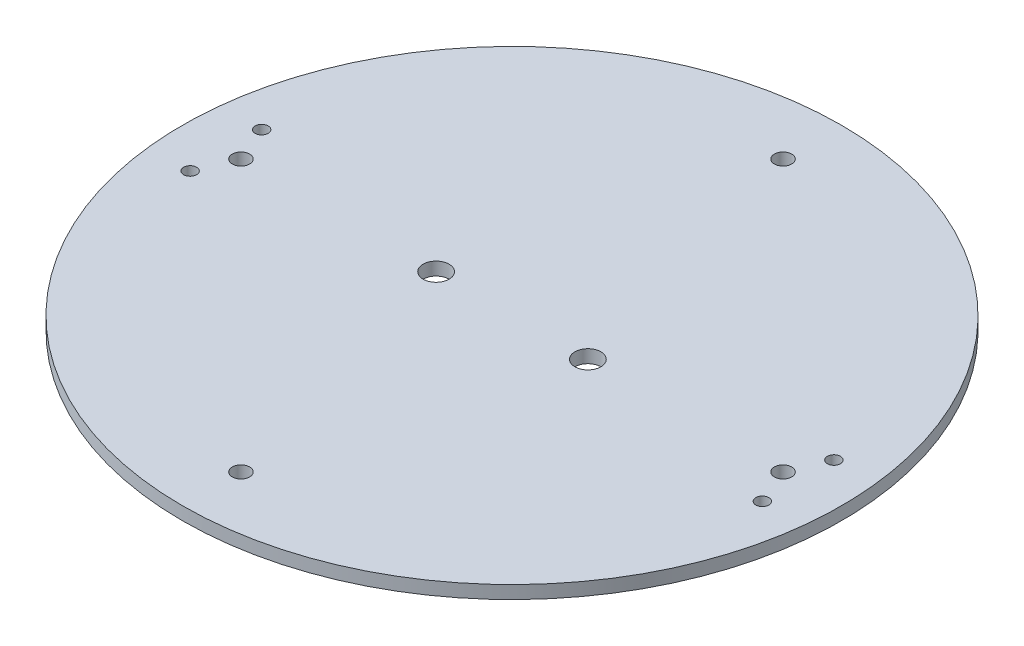
ISO-10303-21;
HEADER;
FILE_DESCRIPTION(('STEP AP214'),'2;1');
FILE_NAME('part.step','',(''),(''),'','','');
FILE_SCHEMA(('AUTOMOTIVE_DESIGN { 1 0 10303 214 1 1 1 1 }'));
ENDSEC;
DATA;
#1=APPLICATION_CONTEXT('core data for automotive mechanical design processes');
#2=APPLICATION_PROTOCOL_DEFINITION('international standard','automotive_design',2000,#1);
#3=PRODUCT_CONTEXT('',#1,'mechanical');
#4=PRODUCT('Part','Part','',(#3));
#5=PRODUCT_RELATED_PRODUCT_CATEGORY('part','',(#4));
#6=PRODUCT_DEFINITION_FORMATION('','',#4);
#7=PRODUCT_DEFINITION_CONTEXT('part definition',#1,'design');
#8=PRODUCT_DEFINITION('design','',#6,#7);
#9=PRODUCT_DEFINITION_SHAPE('','',#8);
#10=(LENGTH_UNIT() NAMED_UNIT(*) SI_UNIT(.MILLI.,.METRE.));
#11=(NAMED_UNIT(*) PLANE_ANGLE_UNIT() SI_UNIT($,.RADIAN.));
#12=(NAMED_UNIT(*) SI_UNIT($,.STERADIAN.) SOLID_ANGLE_UNIT());
#13=UNCERTAINTY_MEASURE_WITH_UNIT(LENGTH_MEASURE(1.E-05),#10,'distance_accuracy_value','');
#14=(GEOMETRIC_REPRESENTATION_CONTEXT(3) GLOBAL_UNCERTAINTY_ASSIGNED_CONTEXT((#13)) GLOBAL_UNIT_ASSIGNED_CONTEXT((#10,
#11,#12)) REPRESENTATION_CONTEXT('',''));
#15=CARTESIAN_POINT('',(0.,0.,0.));
#16=DIRECTION('',(0.,0.,1.));
#17=DIRECTION('',(1.,0.,0.));
#18=AXIS2_PLACEMENT_3D('',#15,#16,#17);
#19=CARTESIAN_POINT('',(0.,3.,0.));
#20=DIRECTION('',(0.,1.,0.));
#21=DIRECTION('',(0.,0.,1.));
#22=AXIS2_PLACEMENT_3D('',#19,#20,#21);
#23=PLANE('',#22);
#24=CARTESIAN_POINT('',(1.02455957371246E-12,3.,62.4999999999992));
#25=DIRECTION('',(0.,1.,0.));
#26=DIRECTION('',(0.,0.,1.));
#27=AXIS2_PLACEMENT_3D('',#24,#25,#26);
#28=CIRCLE('',#27,1.99999999999974);
#29=CARTESIAN_POINT('',(1.02455957371246E-12,3.,64.4999999999989));
#30=VERTEX_POINT('',#29);
#31=EDGE_CURVE('E120',#30,#30,#28,.T.);
#32=ORIENTED_EDGE('',*,*,#31,.F.);
#33=EDGE_LOOP('',(#32));
#34=FACE_BOUND('',#33,.T.);
#35=CARTESIAN_POINT('',(2.18217583677696E-13,3.,-62.5));
#36=DIRECTION('',(0.,1.,0.));
#37=DIRECTION('',(0.,0.,1.));
#38=AXIS2_PLACEMENT_3D('',#35,#36,#37);
#39=CIRCLE('',#38,2.);
#40=CARTESIAN_POINT('',(2.18217583677696E-13,3.,-60.5));
#41=VERTEX_POINT('',#40);
#42=EDGE_CURVE('E104',#41,#41,#39,.T.);
#43=ORIENTED_EDGE('',*,*,#42,.F.);
#44=EDGE_LOOP('',(#43));
#45=FACE_BOUND('',#44,.T.);
#46=CARTESIAN_POINT('',(65.9790854328185,3.,-8.24999999999955));
#47=DIRECTION('',(0.,1.,0.));
#48=DIRECTION('',(0.,0.,1.));
#49=AXIS2_PLACEMENT_3D('',#46,#47,#48);
#50=CIRCLE('',#49,1.49999999999999);
#51=CARTESIAN_POINT('',(65.9790854328185,3.,-6.74999999999955));
#52=VERTEX_POINT('',#51);
#53=EDGE_CURVE('E88',#52,#52,#50,.T.);
#54=ORIENTED_EDGE('',*,*,#53,.F.);
#55=EDGE_LOOP('',(#54));
#56=FACE_BOUND('',#55,.T.);
#57=CARTESIAN_POINT('',(-65.9790854328184,3.,-8.25000000000001));
#58=DIRECTION('',(0.,1.,0.));
#59=DIRECTION('',(0.,0.,1.));
#60=AXIS2_PLACEMENT_3D('',#57,#58,#59);
#61=CIRCLE('',#60,1.5);
#62=CARTESIAN_POINT('',(-65.9790854328184,3.,-6.75000000000001));
#63=VERTEX_POINT('',#62);
#64=EDGE_CURVE('E72',#63,#63,#61,.T.);
#65=ORIENTED_EDGE('',*,*,#64,.F.);
#66=EDGE_LOOP('',(#65));
#67=FACE_BOUND('',#66,.T.);
#68=CARTESIAN_POINT('',(-65.9790854328184,3.,8.25000000000001));
#69=DIRECTION('',(0.,1.,0.));
#70=DIRECTION('',(0.,0.,1.));
#71=AXIS2_PLACEMENT_3D('',#68,#69,#70);
#72=CIRCLE('',#71,1.5);
#73=CARTESIAN_POINT('',(-65.9790854328184,3.,9.75000000000001));
#74=VERTEX_POINT('',#73);
#75=EDGE_CURVE('E58',#74,#74,#72,.T.);
#76=ORIENTED_EDGE('',*,*,#75,.F.);
#77=EDGE_LOOP('',(#76));
#78=FACE_BOUND('',#77,.T.);
#79=CARTESIAN_POINT('',(0.,3.,0.));
#80=DIRECTION('',(0.,1.,0.));
#81=DIRECTION('',(0.,0.,1.));
#82=AXIS2_PLACEMENT_3D('',#79,#80,#81);
#83=CIRCLE('',#82,76.);
#84=CARTESIAN_POINT('',(0.,3.,76.));
#85=VERTEX_POINT('',#84);
#86=EDGE_CURVE('E10',#85,#85,#83,.T.);
#87=ORIENTED_EDGE('',*,*,#86,.T.);
#88=EDGE_LOOP('',(#87));
#89=FACE_BOUND('',#88,.T.);
#90=CARTESIAN_POINT('',(-62.5,3.,0.));
#91=DIRECTION('',(0.,1.,0.));
#92=DIRECTION('',(0.,0.,1.));
#93=AXIS2_PLACEMENT_3D('',#90,#91,#92);
#94=CIRCLE('',#93,2.);
#95=CARTESIAN_POINT('',(-62.5,3.,2.));
#96=VERTEX_POINT('',#95);
#97=EDGE_CURVE('E64',#96,#96,#94,.T.);
#98=ORIENTED_EDGE('',*,*,#97,.F.);
#99=EDGE_LOOP('',(#98));
#100=FACE_BOUND('',#99,.T.);
#101=CARTESIAN_POINT('',(17.5,3.,0.));
#102=DIRECTION('',(0.,1.,0.));
#103=DIRECTION('',(0.,0.,1.));
#104=AXIS2_PLACEMENT_3D('',#101,#102,#103);
#105=CIRCLE('',#104,3.);
#106=CARTESIAN_POINT('',(17.5,3.,3.));
#107=VERTEX_POINT('',#106);
#108=EDGE_CURVE('E80',#107,#107,#105,.T.);
#109=ORIENTED_EDGE('',*,*,#108,.F.);
#110=EDGE_LOOP('',(#109));
#111=FACE_BOUND('',#110,.T.);
#112=CARTESIAN_POINT('',(65.9790854328184,3.,8.25000000000047));
#113=DIRECTION('',(0.,1.,0.));
#114=DIRECTION('',(0.,0.,1.));
#115=AXIS2_PLACEMENT_3D('',#112,#113,#114);
#116=CIRCLE('',#115,1.49999999999999);
#117=CARTESIAN_POINT('',(65.9790854328184,3.,9.75000000000046));
#118=VERTEX_POINT('',#117);
#119=EDGE_CURVE('E96',#118,#118,#116,.T.);
#120=ORIENTED_EDGE('',*,*,#119,.F.);
#121=EDGE_LOOP('',(#120));
#122=FACE_BOUND('',#121,.T.);
#123=CARTESIAN_POINT('',(62.5000000000002,3.,-1.81176645751055E-12));
#124=DIRECTION('',(0.,1.,0.));
#125=DIRECTION('',(0.,0.,1.));
#126=AXIS2_PLACEMENT_3D('',#123,#124,#125);
#127=CIRCLE('',#126,2.00000000000088);
#128=CARTESIAN_POINT('',(62.5000000000002,3.,1.99999999999906));
#129=VERTEX_POINT('',#128);
#130=EDGE_CURVE('E112',#129,#129,#127,.T.);
#131=ORIENTED_EDGE('',*,*,#130,.F.);
#132=EDGE_LOOP('',(#131));
#133=FACE_BOUND('',#132,.T.);
#134=CARTESIAN_POINT('',(-17.5,3.,0.));
#135=DIRECTION('',(0.,1.,0.));
#136=DIRECTION('',(0.,0.,1.));
#137=AXIS2_PLACEMENT_3D('',#134,#135,#136);
#138=CIRCLE('',#137,3.);
#139=CARTESIAN_POINT('',(-17.5,3.,3.));
#140=VERTEX_POINT('',#139);
#141=EDGE_CURVE('E128',#140,#140,#138,.T.);
#142=ORIENTED_EDGE('',*,*,#141,.F.);
#143=EDGE_LOOP('',(#142));
#144=FACE_BOUND('',#143,.T.);
#145=ADVANCED_FACE('F43',(#34,#45,#56,#67,#78,#89,#100,#111,#122,#133,#144),#23,.T.);
#146=CARTESIAN_POINT('',(0.,0.,0.));
#147=DIRECTION('',(0.,1.,0.));
#148=DIRECTION('',(0.,0.,1.));
#149=AXIS2_PLACEMENT_3D('',#146,#147,#148);
#150=PLANE('',#149);
#151=CARTESIAN_POINT('',(0.,0.,0.));
#152=DIRECTION('',(0.,1.,0.));
#153=DIRECTION('',(0.,0.,1.));
#154=AXIS2_PLACEMENT_3D('',#151,#152,#153);
#155=CIRCLE('',#154,76.);
#156=CARTESIAN_POINT('',(0.,0.,76.));
#157=VERTEX_POINT('',#156);
#158=EDGE_CURVE('E47',#157,#157,#155,.T.);
#159=ORIENTED_EDGE('',*,*,#158,.F.);
#160=EDGE_LOOP('',(#159));
#161=FACE_BOUND('',#160,.T.);
#162=CARTESIAN_POINT('',(-65.9790854328184,0.,8.25000000000001));
#163=DIRECTION('',(0.,1.,0.));
#164=DIRECTION('',(0.,0.,1.));
#165=AXIS2_PLACEMENT_3D('',#162,#163,#164);
#166=CIRCLE('',#165,1.5);
#167=CARTESIAN_POINT('',(-65.9790854328184,0.,9.75000000000001));
#168=VERTEX_POINT('',#167);
#169=EDGE_CURVE('E60',#168,#168,#166,.T.);
#170=ORIENTED_EDGE('',*,*,#169,.T.);
#171=EDGE_LOOP('',(#170));
#172=FACE_BOUND('',#171,.T.);
#173=CARTESIAN_POINT('',(-62.5,0.,0.));
#174=DIRECTION('',(0.,1.,0.));
#175=DIRECTION('',(0.,0.,1.));
#176=AXIS2_PLACEMENT_3D('',#173,#174,#175);
#177=CIRCLE('',#176,2.);
#178=CARTESIAN_POINT('',(-62.5,0.,2.));
#179=VERTEX_POINT('',#178);
#180=EDGE_CURVE('E68',#179,#179,#177,.T.);
#181=ORIENTED_EDGE('',*,*,#180,.T.);
#182=EDGE_LOOP('',(#181));
#183=FACE_BOUND('',#182,.T.);
#184=CARTESIAN_POINT('',(-65.9790854328184,0.,-8.25000000000001));
#185=DIRECTION('',(0.,1.,0.));
#186=DIRECTION('',(0.,0.,1.));
#187=AXIS2_PLACEMENT_3D('',#184,#185,#186);
#188=CIRCLE('',#187,1.5);
#189=CARTESIAN_POINT('',(-65.9790854328184,0.,-6.75000000000001));
#190=VERTEX_POINT('',#189);
#191=EDGE_CURVE('E76',#190,#190,#188,.T.);
#192=ORIENTED_EDGE('',*,*,#191,.T.);
#193=EDGE_LOOP('',(#192));
#194=FACE_BOUND('',#193,.T.);
#195=CARTESIAN_POINT('',(17.5,0.,0.));
#196=DIRECTION('',(0.,1.,0.));
#197=DIRECTION('',(0.,0.,1.));
#198=AXIS2_PLACEMENT_3D('',#195,#196,#197);
#199=CIRCLE('',#198,3.);
#200=CARTESIAN_POINT('',(17.5,0.,3.));
#201=VERTEX_POINT('',#200);
#202=EDGE_CURVE('E84',#201,#201,#199,.T.);
#203=ORIENTED_EDGE('',*,*,#202,.T.);
#204=EDGE_LOOP('',(#203));
#205=FACE_BOUND('',#204,.T.);
#206=CARTESIAN_POINT('',(65.9790854328185,0.,-8.24999999999955));
#207=DIRECTION('',(0.,1.,0.));
#208=DIRECTION('',(0.,0.,1.));
#209=AXIS2_PLACEMENT_3D('',#206,#207,#208);
#210=CIRCLE('',#209,1.49999999999999);
#211=CARTESIAN_POINT('',(65.9790854328185,0.,-6.74999999999955));
#212=VERTEX_POINT('',#211);
#213=EDGE_CURVE('E92',#212,#212,#210,.T.);
#214=ORIENTED_EDGE('',*,*,#213,.T.);
#215=EDGE_LOOP('',(#214));
#216=FACE_BOUND('',#215,.T.);
#217=CARTESIAN_POINT('',(65.9790854328184,0.,8.25000000000047));
#218=DIRECTION('',(0.,1.,0.));
#219=DIRECTION('',(0.,0.,1.));
#220=AXIS2_PLACEMENT_3D('',#217,#218,#219);
#221=CIRCLE('',#220,1.49999999999999);
#222=CARTESIAN_POINT('',(65.9790854328184,0.,9.75000000000046));
#223=VERTEX_POINT('',#222);
#224=EDGE_CURVE('E100',#223,#223,#221,.T.);
#225=ORIENTED_EDGE('',*,*,#224,.T.);
#226=EDGE_LOOP('',(#225));
#227=FACE_BOUND('',#226,.T.);
#228=CARTESIAN_POINT('',(2.18217583677696E-13,0.,-62.5));
#229=DIRECTION('',(0.,1.,0.));
#230=DIRECTION('',(0.,0.,1.));
#231=AXIS2_PLACEMENT_3D('',#228,#229,#230);
#232=CIRCLE('',#231,2.);
#233=CARTESIAN_POINT('',(2.18217583677696E-13,0.,-60.5));
#234=VERTEX_POINT('',#233);
#235=EDGE_CURVE('E108',#234,#234,#232,.T.);
#236=ORIENTED_EDGE('',*,*,#235,.T.);
#237=EDGE_LOOP('',(#236));
#238=FACE_BOUND('',#237,.T.);
#239=CARTESIAN_POINT('',(62.5000000000002,0.,-1.81176645751055E-12));
#240=DIRECTION('',(0.,1.,0.));
#241=DIRECTION('',(0.,0.,1.));
#242=AXIS2_PLACEMENT_3D('',#239,#240,#241);
#243=CIRCLE('',#242,2.00000000000088);
#244=CARTESIAN_POINT('',(62.5000000000002,0.,1.99999999999906));
#245=VERTEX_POINT('',#244);
#246=EDGE_CURVE('E116',#245,#245,#243,.T.);
#247=ORIENTED_EDGE('',*,*,#246,.T.);
#248=EDGE_LOOP('',(#247));
#249=FACE_BOUND('',#248,.T.);
#250=CARTESIAN_POINT('',(1.02455957371246E-12,0.,62.4999999999992));
#251=DIRECTION('',(0.,1.,0.));
#252=DIRECTION('',(0.,0.,1.));
#253=AXIS2_PLACEMENT_3D('',#250,#251,#252);
#254=CIRCLE('',#253,1.99999999999974);
#255=CARTESIAN_POINT('',(1.02455957371246E-12,0.,64.4999999999989));
#256=VERTEX_POINT('',#255);
#257=EDGE_CURVE('E124',#256,#256,#254,.T.);
#258=ORIENTED_EDGE('',*,*,#257,.T.);
#259=EDGE_LOOP('',(#258));
#260=FACE_BOUND('',#259,.T.);
#261=CARTESIAN_POINT('',(-17.5,0.,0.));
#262=DIRECTION('',(0.,1.,0.));
#263=DIRECTION('',(0.,0.,1.));
#264=AXIS2_PLACEMENT_3D('',#261,#262,#263);
#265=CIRCLE('',#264,3.);
#266=CARTESIAN_POINT('',(-17.5,0.,3.));
#267=VERTEX_POINT('',#266);
#268=EDGE_CURVE('E132',#267,#267,#265,.T.);
#269=ORIENTED_EDGE('',*,*,#268,.T.);
#270=EDGE_LOOP('',(#269));
#271=FACE_BOUND('',#270,.T.);
#272=ADVANCED_FACE('F146',(#161,#172,#183,#194,#205,#216,#227,#238,#249,#260,#271),#150,.F.);
#273=CARTESIAN_POINT('',(0.,3.,0.));
#274=DIRECTION('',(0.,-1.,0.));
#275=DIRECTION('',(0.,0.,-1.));
#276=AXIS2_PLACEMENT_3D('',#273,#274,#275);
#277=CYLINDRICAL_SURFACE('',#276,76.);
#278=ORIENTED_EDGE('',*,*,#86,.F.);
#279=EDGE_LOOP('',(#278));
#280=FACE_BOUND('',#279,.T.);
#281=ORIENTED_EDGE('',*,*,#158,.T.);
#282=EDGE_LOOP('',(#281));
#283=FACE_BOUND('',#282,.T.);
#284=ADVANCED_FACE('F45',(#280,#283),#277,.T.);
#285=CARTESIAN_POINT('',(-65.9790854328184,3.,8.25000000000001));
#286=DIRECTION('',(0.,-1.,0.));
#287=DIRECTION('',(0.,0.,-1.));
#288=AXIS2_PLACEMENT_3D('',#285,#286,#287);
#289=CYLINDRICAL_SURFACE('',#288,1.5);
#290=ORIENTED_EDGE('',*,*,#75,.T.);
#291=EDGE_LOOP('',(#290));
#292=FACE_BOUND('',#291,.T.);
#293=ORIENTED_EDGE('',*,*,#169,.F.);
#294=EDGE_LOOP('',(#293));
#295=FACE_BOUND('',#294,.T.);
#296=ADVANCED_FACE('F156',(#292,#295),#289,.F.);
#297=CARTESIAN_POINT('',(-62.5,3.,0.));
#298=DIRECTION('',(0.,-1.,0.));
#299=DIRECTION('',(0.,0.,-1.));
#300=AXIS2_PLACEMENT_3D('',#297,#298,#299);
#301=CYLINDRICAL_SURFACE('',#300,2.);
#302=ORIENTED_EDGE('',*,*,#97,.T.);
#303=EDGE_LOOP('',(#302));
#304=FACE_BOUND('',#303,.T.);
#305=ORIENTED_EDGE('',*,*,#180,.F.);
#306=EDGE_LOOP('',(#305));
#307=FACE_BOUND('',#306,.T.);
#308=ADVANCED_FACE('F159',(#304,#307),#301,.F.);
#309=CARTESIAN_POINT('',(-65.9790854328184,3.,-8.25000000000001));
#310=DIRECTION('',(0.,-1.,0.));
#311=DIRECTION('',(0.,0.,-1.));
#312=AXIS2_PLACEMENT_3D('',#309,#310,#311);
#313=CYLINDRICAL_SURFACE('',#312,1.5);
#314=ORIENTED_EDGE('',*,*,#64,.T.);
#315=EDGE_LOOP('',(#314));
#316=FACE_BOUND('',#315,.T.);
#317=ORIENTED_EDGE('',*,*,#191,.F.);
#318=EDGE_LOOP('',(#317));
#319=FACE_BOUND('',#318,.T.);
#320=ADVANCED_FACE('F163',(#316,#319),#313,.F.);
#321=CARTESIAN_POINT('',(17.5,3.,0.));
#322=DIRECTION('',(0.,-1.,0.));
#323=DIRECTION('',(0.,0.,-1.));
#324=AXIS2_PLACEMENT_3D('',#321,#322,#323);
#325=CYLINDRICAL_SURFACE('',#324,3.);
#326=ORIENTED_EDGE('',*,*,#108,.T.);
#327=EDGE_LOOP('',(#326));
#328=FACE_BOUND('',#327,.T.);
#329=ORIENTED_EDGE('',*,*,#202,.F.);
#330=EDGE_LOOP('',(#329));
#331=FACE_BOUND('',#330,.T.);
#332=ADVANCED_FACE('F167',(#328,#331),#325,.F.);
#333=CARTESIAN_POINT('',(65.9790854328185,3.,-8.24999999999955));
#334=DIRECTION('',(0.,-1.,0.));
#335=DIRECTION('',(0.,0.,-1.));
#336=AXIS2_PLACEMENT_3D('',#333,#334,#335);
#337=CYLINDRICAL_SURFACE('',#336,1.49999999999999);
#338=ORIENTED_EDGE('',*,*,#53,.T.);
#339=EDGE_LOOP('',(#338));
#340=FACE_BOUND('',#339,.T.);
#341=ORIENTED_EDGE('',*,*,#213,.F.);
#342=EDGE_LOOP('',(#341));
#343=FACE_BOUND('',#342,.T.);
#344=ADVANCED_FACE('F171',(#340,#343),#337,.F.);
#345=CARTESIAN_POINT('',(65.9790854328184,3.,8.25000000000047));
#346=DIRECTION('',(0.,-1.,0.));
#347=DIRECTION('',(0.,0.,-1.));
#348=AXIS2_PLACEMENT_3D('',#345,#346,#347);
#349=CYLINDRICAL_SURFACE('',#348,1.49999999999999);
#350=ORIENTED_EDGE('',*,*,#119,.T.);
#351=EDGE_LOOP('',(#350));
#352=FACE_BOUND('',#351,.T.);
#353=ORIENTED_EDGE('',*,*,#224,.F.);
#354=EDGE_LOOP('',(#353));
#355=FACE_BOUND('',#354,.T.);
#356=ADVANCED_FACE('F175',(#352,#355),#349,.F.);
#357=CARTESIAN_POINT('',(2.18217583677696E-13,3.,-62.5));
#358=DIRECTION('',(0.,-1.,0.));
#359=DIRECTION('',(0.,0.,-1.));
#360=AXIS2_PLACEMENT_3D('',#357,#358,#359);
#361=CYLINDRICAL_SURFACE('',#360,2.);
#362=ORIENTED_EDGE('',*,*,#42,.T.);
#363=EDGE_LOOP('',(#362));
#364=FACE_BOUND('',#363,.T.);
#365=ORIENTED_EDGE('',*,*,#235,.F.);
#366=EDGE_LOOP('',(#365));
#367=FACE_BOUND('',#366,.T.);
#368=ADVANCED_FACE('F179',(#364,#367),#361,.F.);
#369=CARTESIAN_POINT('',(62.5000000000002,3.,-1.81176645751055E-12));
#370=DIRECTION('',(0.,-1.,0.));
#371=DIRECTION('',(0.,0.,-1.));
#372=AXIS2_PLACEMENT_3D('',#369,#370,#371);
#373=CYLINDRICAL_SURFACE('',#372,2.00000000000088);
#374=ORIENTED_EDGE('',*,*,#130,.T.);
#375=EDGE_LOOP('',(#374));
#376=FACE_BOUND('',#375,.T.);
#377=ORIENTED_EDGE('',*,*,#246,.F.);
#378=EDGE_LOOP('',(#377));
#379=FACE_BOUND('',#378,.T.);
#380=ADVANCED_FACE('F183',(#376,#379),#373,.F.);
#381=CARTESIAN_POINT('',(1.02455957371246E-12,3.,62.4999999999992));
#382=DIRECTION('',(0.,-1.,0.));
#383=DIRECTION('',(0.,0.,-1.));
#384=AXIS2_PLACEMENT_3D('',#381,#382,#383);
#385=CYLINDRICAL_SURFACE('',#384,1.99999999999974);
#386=ORIENTED_EDGE('',*,*,#31,.T.);
#387=EDGE_LOOP('',(#386));
#388=FACE_BOUND('',#387,.T.);
#389=ORIENTED_EDGE('',*,*,#257,.F.);
#390=EDGE_LOOP('',(#389));
#391=FACE_BOUND('',#390,.T.);
#392=ADVANCED_FACE('F187',(#388,#391),#385,.F.);
#393=CARTESIAN_POINT('',(-17.5,3.,0.));
#394=DIRECTION('',(0.,-1.,0.));
#395=DIRECTION('',(0.,0.,-1.));
#396=AXIS2_PLACEMENT_3D('',#393,#394,#395);
#397=CYLINDRICAL_SURFACE('',#396,3.);
#398=ORIENTED_EDGE('',*,*,#141,.T.);
#399=EDGE_LOOP('',(#398));
#400=FACE_BOUND('',#399,.T.);
#401=ORIENTED_EDGE('',*,*,#268,.F.);
#402=EDGE_LOOP('',(#401));
#403=FACE_BOUND('',#402,.T.);
#404=ADVANCED_FACE('F142',(#400,#403),#397,.F.);
#405=CLOSED_SHELL('',(#145,#272,#284,#296,#308,#320,#332,#344,#356,#368,#380,#392,#404));
#406=MANIFOLD_SOLID_BREP('B2',#405);
#407=ADVANCED_BREP_SHAPE_REPRESENTATION('',(#18,#406),#14);
#408=SHAPE_DEFINITION_REPRESENTATION(#9,#407);
ENDSEC;
END-ISO-10303-21;
